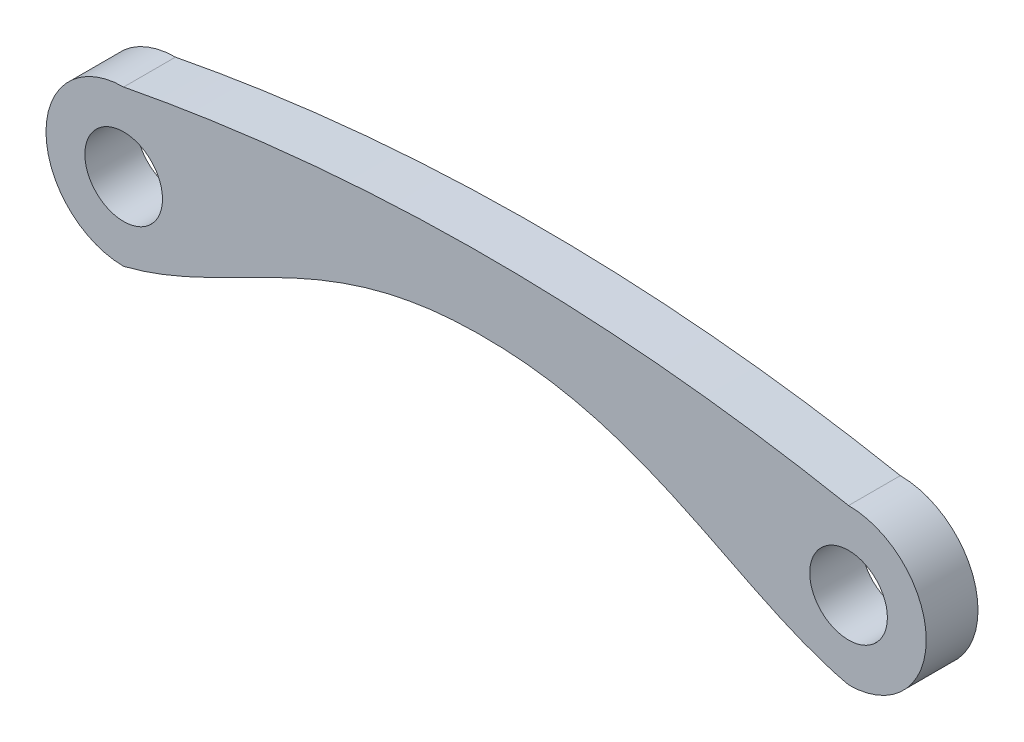
ISO-10303-21;
HEADER;
FILE_DESCRIPTION(('STEP AP214'),'2;1');
FILE_NAME('part.step','',(''),(''),'','','');
FILE_SCHEMA(('AUTOMOTIVE_DESIGN { 1 0 10303 214 1 1 1 1 }'));
ENDSEC;
DATA;
#1=APPLICATION_CONTEXT('core data for automotive mechanical design processes');
#2=APPLICATION_PROTOCOL_DEFINITION('international standard','automotive_design',2000,#1);
#3=PRODUCT_CONTEXT('',#1,'mechanical');
#4=PRODUCT('Part','Part','',(#3));
#5=PRODUCT_RELATED_PRODUCT_CATEGORY('part','',(#4));
#6=PRODUCT_DEFINITION_FORMATION('','',#4);
#7=PRODUCT_DEFINITION_CONTEXT('part definition',#1,'design');
#8=PRODUCT_DEFINITION('design','',#6,#7);
#9=PRODUCT_DEFINITION_SHAPE('','',#8);
#10=(LENGTH_UNIT() NAMED_UNIT(*) SI_UNIT(.MILLI.,.METRE.));
#11=(NAMED_UNIT(*) PLANE_ANGLE_UNIT() SI_UNIT($,.RADIAN.));
#12=(NAMED_UNIT(*) SI_UNIT($,.STERADIAN.) SOLID_ANGLE_UNIT());
#13=UNCERTAINTY_MEASURE_WITH_UNIT(LENGTH_MEASURE(1.E-05),#10,'distance_accuracy_value','');
#14=(GEOMETRIC_REPRESENTATION_CONTEXT(3) GLOBAL_UNCERTAINTY_ASSIGNED_CONTEXT((#13)) GLOBAL_UNIT_ASSIGNED_CONTEXT((#10,
#11,#12)) REPRESENTATION_CONTEXT('',''));
#15=CARTESIAN_POINT('',(0.,0.,0.));
#16=DIRECTION('',(0.,0.,1.));
#17=DIRECTION('',(1.,0.,0.));
#18=AXIS2_PLACEMENT_3D('',#15,#16,#17);
#19=CARTESIAN_POINT('',(0.032339048654912,1.59973880237349,2.));
#20=DIRECTION('',(0.,0.,-1.));
#21=DIRECTION('',(-1.,0.,0.));
#22=AXIS2_PLACEMENT_3D('',#19,#20,#21);
#23=PLANE('',#22);
#24=CARTESIAN_POINT('',(-14.,-3.,2.));
#25=CARTESIAN_POINT('',(-10.1107752883511,-2.02548894263884,2.));
#26=CARTESIAN_POINT('',(-6.33231391109442,1.68138389225812,2.));
#27=CARTESIAN_POINT('',(6.35903930987397,1.57955566577624,2.));
#28=CARTESIAN_POINT('',(10.1379866039465,-2.11235598971822,2.));
#29=CARTESIAN_POINT('',(14.,-3.00000000000001,2.));
#30=B_SPLINE_CURVE_WITH_KNOTS('',3,(#24,#25,#26,#27,#28,#29),.UNSPECIFIED.,.F.,.F.,(4,1,1,4),
(0.,0.449202301528146,0.549202301528145,1.),.UNSPECIFIED.);
#31=CARTESIAN_POINT('',(-14.,-3.,2.));
#32=VERTEX_POINT('',#31);
#33=CARTESIAN_POINT('',(14.,-3.,2.));
#34=VERTEX_POINT('',#33);
#35=EDGE_CURVE('E99',#32,#34,#30,.T.);
#36=ORIENTED_EDGE('',*,*,#35,.T.);
#37=CARTESIAN_POINT('',(14.,0.,2.));
#38=DIRECTION('',(0.,0.,1.));
#39=DIRECTION('',(1.,0.,0.));
#40=AXIS2_PLACEMENT_3D('',#37,#38,#39);
#41=CIRCLE('',#40,3.);
#42=CARTESIAN_POINT('',(14.,3.,2.));
#43=VERTEX_POINT('',#42);
#44=EDGE_CURVE('E94',#34,#43,#41,.T.);
#45=ORIENTED_EDGE('',*,*,#44,.T.);
#46=CARTESIAN_POINT('',(14.,3.,2.));
#47=CARTESIAN_POINT('',(0.,5.7,2.));
#48=CARTESIAN_POINT('',(-14.,3.,2.));
#49=B_SPLINE_CURVE_WITH_KNOTS('',2,(#46,#47,#48),.UNSPECIFIED.,.F.,.F.,(3,3),(0.,1.),.UNSPECIFIED.);
#50=CARTESIAN_POINT('',(-14.,3.,2.));
#51=VERTEX_POINT('',#50);
#52=EDGE_CURVE('E97',#43,#51,#49,.T.);
#53=ORIENTED_EDGE('',*,*,#52,.T.);
#54=CARTESIAN_POINT('',(-14.,0.,2.));
#55=DIRECTION('',(0.,0.,1.));
#56=DIRECTION('',(1.,0.,0.));
#57=AXIS2_PLACEMENT_3D('',#54,#55,#56);
#58=CIRCLE('',#57,3.);
#59=EDGE_CURVE('E64',#51,#32,#58,.T.);
#60=ORIENTED_EDGE('',*,*,#59,.T.);
#61=EDGE_LOOP('',(#36,#45,#53,#60));
#62=FACE_BOUND('',#61,.T.);
#63=CARTESIAN_POINT('',(-14.,0.,2.));
#64=DIRECTION('',(0.,0.,1.));
#65=DIRECTION('',(1.,0.,0.));
#66=AXIS2_PLACEMENT_3D('',#63,#64,#65);
#67=CIRCLE('',#66,1.5);
#68=CARTESIAN_POINT('',(-12.5,0.,2.));
#69=VERTEX_POINT('',#68);
#70=EDGE_CURVE('E161',#69,#69,#67,.T.);
#71=ORIENTED_EDGE('',*,*,#70,.F.);
#72=EDGE_LOOP('',(#71));
#73=FACE_BOUND('',#72,.T.);
#74=CARTESIAN_POINT('',(14.,0.,2.));
#75=DIRECTION('',(0.,0.,1.));
#76=DIRECTION('',(1.,0.,0.));
#77=AXIS2_PLACEMENT_3D('',#74,#75,#76);
#78=CIRCLE('',#77,1.5);
#79=CARTESIAN_POINT('',(15.5,0.,2.));
#80=VERTEX_POINT('',#79);
#81=EDGE_CURVE('E150',#80,#80,#78,.T.);
#82=ORIENTED_EDGE('',*,*,#81,.F.);
#83=EDGE_LOOP('',(#82));
#84=FACE_BOUND('',#83,.T.);
#85=ADVANCED_FACE('F45',(#62,#73,#84),#23,.F.);
#86=CARTESIAN_POINT('',(0.032339048654912,1.59973880237349,0.));
#87=DIRECTION('',(0.,0.,-1.));
#88=DIRECTION('',(-1.,0.,0.));
#89=AXIS2_PLACEMENT_3D('',#86,#87,#88);
#90=PLANE('',#89);
#91=CARTESIAN_POINT('',(-14.,0.,0.));
#92=DIRECTION('',(0.,0.,1.));
#93=DIRECTION('',(1.,0.,0.));
#94=AXIS2_PLACEMENT_3D('',#91,#92,#93);
#95=CIRCLE('',#94,1.5);
#96=CARTESIAN_POINT('',(-12.5,0.,0.));
#97=VERTEX_POINT('',#96);
#98=EDGE_CURVE('E158',#97,#97,#95,.T.);
#99=ORIENTED_EDGE('',*,*,#98,.T.);
#100=EDGE_LOOP('',(#99));
#101=FACE_BOUND('',#100,.T.);
#102=CARTESIAN_POINT('',(-14.,-3.,0.));
#103=CARTESIAN_POINT('',(-10.1107752883511,-2.02548894263884,0.));
#104=CARTESIAN_POINT('',(-6.33231391109442,1.68138389225812,0.));
#105=CARTESIAN_POINT('',(6.35903930987397,1.57955566577624,0.));
#106=CARTESIAN_POINT('',(10.1379866039465,-2.11235598971822,0.));
#107=CARTESIAN_POINT('',(14.,-3.00000000000001,0.));
#108=B_SPLINE_CURVE_WITH_KNOTS('',3,(#102,#103,#104,#105,#106,#107),.UNSPECIFIED.,.F.,.F.,(4,1,
1,4),(0.,0.449202301528146,0.549202301528145,1.),.UNSPECIFIED.);
#109=CARTESIAN_POINT('',(-14.,-3.,0.));
#110=VERTEX_POINT('',#109);
#111=CARTESIAN_POINT('',(14.,-3.,0.));
#112=VERTEX_POINT('',#111);
#113=EDGE_CURVE('E165',#110,#112,#108,.T.);
#114=ORIENTED_EDGE('',*,*,#113,.F.);
#115=CARTESIAN_POINT('',(-14.,0.,0.));
#116=DIRECTION('',(0.,0.,1.));
#117=DIRECTION('',(1.,0.,0.));
#118=AXIS2_PLACEMENT_3D('',#115,#116,#117);
#119=CIRCLE('',#118,3.);
#120=CARTESIAN_POINT('',(-14.,3.,0.));
#121=VERTEX_POINT('',#120);
#122=EDGE_CURVE('E87',#121,#110,#119,.T.);
#123=ORIENTED_EDGE('',*,*,#122,.F.);
#124=CARTESIAN_POINT('',(14.,3.,0.));
#125=CARTESIAN_POINT('',(0.,5.7,0.));
#126=CARTESIAN_POINT('',(-14.,3.,0.));
#127=B_SPLINE_CURVE_WITH_KNOTS('',2,(#124,#125,#126),.UNSPECIFIED.,.F.,.F.,(3,3),(0.,1.),.UNSPECIFIED.);
#128=CARTESIAN_POINT('',(14.,3.,0.));
#129=VERTEX_POINT('',#128);
#130=EDGE_CURVE('E81',#129,#121,#127,.T.);
#131=ORIENTED_EDGE('',*,*,#130,.F.);
#132=CARTESIAN_POINT('',(14.,0.,0.));
#133=DIRECTION('',(0.,0.,1.));
#134=DIRECTION('',(1.,0.,0.));
#135=AXIS2_PLACEMENT_3D('',#132,#133,#134);
#136=CIRCLE('',#135,3.);
#137=EDGE_CURVE('E104',#112,#129,#136,.T.);
#138=ORIENTED_EDGE('',*,*,#137,.F.);
#139=EDGE_LOOP('',(#114,#123,#131,#138));
#140=FACE_BOUND('',#139,.T.);
#141=CARTESIAN_POINT('',(14.,0.,0.));
#142=DIRECTION('',(0.,0.,1.));
#143=DIRECTION('',(1.,0.,0.));
#144=AXIS2_PLACEMENT_3D('',#141,#142,#143);
#145=CIRCLE('',#144,1.5);
#146=CARTESIAN_POINT('',(15.5,0.,0.));
#147=VERTEX_POINT('',#146);
#148=EDGE_CURVE('E153',#147,#147,#145,.T.);
#149=ORIENTED_EDGE('',*,*,#148,.T.);
#150=EDGE_LOOP('',(#149));
#151=FACE_BOUND('',#150,.T.);
#152=ADVANCED_FACE('F129',(#101,#140,#151),#90,.T.);
#153=DIRECTION('',(0.,0.,-1.));
#154=VECTOR('',#153,1.);
#155=SURFACE_OF_LINEAR_EXTRUSION('',#30,#154);
#156=ORIENTED_EDGE('',*,*,#113,.T.);
#157=DIRECTION('',(0.,0.,-1.));
#158=VECTOR('',#157,1.);
#159=CARTESIAN_POINT('',(14.,-3.,2.));
#160=LINE('',#159,#158);
#161=EDGE_CURVE('E11',#34,#112,#160,.T.);
#162=ORIENTED_EDGE('',*,*,#161,.F.);
#163=ORIENTED_EDGE('',*,*,#35,.F.);
#164=DIRECTION('',(0.,0.,-1.));
#165=VECTOR('',#164,1.);
#166=CARTESIAN_POINT('',(-14.,-3.,2.));
#167=LINE('',#166,#165);
#168=EDGE_CURVE('E111',#32,#110,#167,.T.);
#169=ORIENTED_EDGE('',*,*,#168,.T.);
#170=EDGE_LOOP('',(#156,#162,#163,#169));
#171=FACE_BOUND('',#170,.T.);
#172=ADVANCED_FACE('F47',(#171),#155,.F.);
#173=CARTESIAN_POINT('',(14.,0.,2.));
#174=DIRECTION('',(0.,0.,-1.));
#175=DIRECTION('',(-1.,0.,0.));
#176=AXIS2_PLACEMENT_3D('',#173,#174,#175);
#177=CYLINDRICAL_SURFACE('',#176,3.);
#178=ORIENTED_EDGE('',*,*,#137,.T.);
#179=DIRECTION('',(0.,0.,-1.));
#180=VECTOR('',#179,1.);
#181=CARTESIAN_POINT('',(14.,3.,2.));
#182=LINE('',#181,#180);
#183=EDGE_CURVE('E56',#43,#129,#182,.T.);
#184=ORIENTED_EDGE('',*,*,#183,.F.);
#185=ORIENTED_EDGE('',*,*,#44,.F.);
#186=ORIENTED_EDGE('',*,*,#161,.T.);
#187=EDGE_LOOP('',(#178,#184,#185,#186));
#188=FACE_BOUND('',#187,.T.);
#189=ADVANCED_FACE('F103',(#188),#177,.T.);
#190=DIRECTION('',(0.,0.,-1.));
#191=VECTOR('',#190,1.);
#192=SURFACE_OF_LINEAR_EXTRUSION('',#49,#191);
#193=ORIENTED_EDGE('',*,*,#130,.T.);
#194=DIRECTION('',(0.,0.,-1.));
#195=VECTOR('',#194,1.);
#196=CARTESIAN_POINT('',(-14.,3.,2.));
#197=LINE('',#196,#195);
#198=EDGE_CURVE('E106',#51,#121,#197,.T.);
#199=ORIENTED_EDGE('',*,*,#198,.F.);
#200=ORIENTED_EDGE('',*,*,#52,.F.);
#201=ORIENTED_EDGE('',*,*,#183,.T.);
#202=EDGE_LOOP('',(#193,#199,#200,#201));
#203=FACE_BOUND('',#202,.T.);
#204=ADVANCED_FACE('F107',(#203),#192,.F.);
#205=CARTESIAN_POINT('',(-14.,0.,2.));
#206=DIRECTION('',(0.,0.,-1.));
#207=DIRECTION('',(-1.,0.,0.));
#208=AXIS2_PLACEMENT_3D('',#205,#206,#207);
#209=CYLINDRICAL_SURFACE('',#208,3.);
#210=ORIENTED_EDGE('',*,*,#122,.T.);
#211=ORIENTED_EDGE('',*,*,#168,.F.);
#212=ORIENTED_EDGE('',*,*,#59,.F.);
#213=ORIENTED_EDGE('',*,*,#198,.T.);
#214=EDGE_LOOP('',(#210,#211,#212,#213));
#215=FACE_BOUND('',#214,.T.);
#216=ADVANCED_FACE('F123',(#215),#209,.T.);
#217=CARTESIAN_POINT('',(-14.,0.,2.));
#218=DIRECTION('',(0.,0.,-1.));
#219=DIRECTION('',(-1.,0.,0.));
#220=AXIS2_PLACEMENT_3D('',#217,#218,#219);
#221=CYLINDRICAL_SURFACE('',#220,1.5);
#222=ORIENTED_EDGE('',*,*,#70,.T.);
#223=EDGE_LOOP('',(#222));
#224=FACE_BOUND('',#223,.T.);
#225=ORIENTED_EDGE('',*,*,#98,.F.);
#226=EDGE_LOOP('',(#225));
#227=FACE_BOUND('',#226,.T.);
#228=ADVANCED_FACE('F138',(#224,#227),#221,.F.);
#229=CARTESIAN_POINT('',(14.,0.,2.));
#230=DIRECTION('',(0.,0.,-1.));
#231=DIRECTION('',(-1.,0.,0.));
#232=AXIS2_PLACEMENT_3D('',#229,#230,#231);
#233=CYLINDRICAL_SURFACE('',#232,1.5);
#234=ORIENTED_EDGE('',*,*,#81,.T.);
#235=EDGE_LOOP('',(#234));
#236=FACE_BOUND('',#235,.T.);
#237=ORIENTED_EDGE('',*,*,#148,.F.);
#238=EDGE_LOOP('',(#237));
#239=FACE_BOUND('',#238,.T.);
#240=ADVANCED_FACE('F141',(#236,#239),#233,.F.);
#241=CLOSED_SHELL('',(#85,#152,#172,#189,#204,#216,#228,#240));
#242=MANIFOLD_SOLID_BREP('B2',#241);
#243=ADVANCED_BREP_SHAPE_REPRESENTATION('',(#18,#242),#14);
#244=SHAPE_DEFINITION_REPRESENTATION(#9,#243);
ENDSEC;
END-ISO-10303-21;
